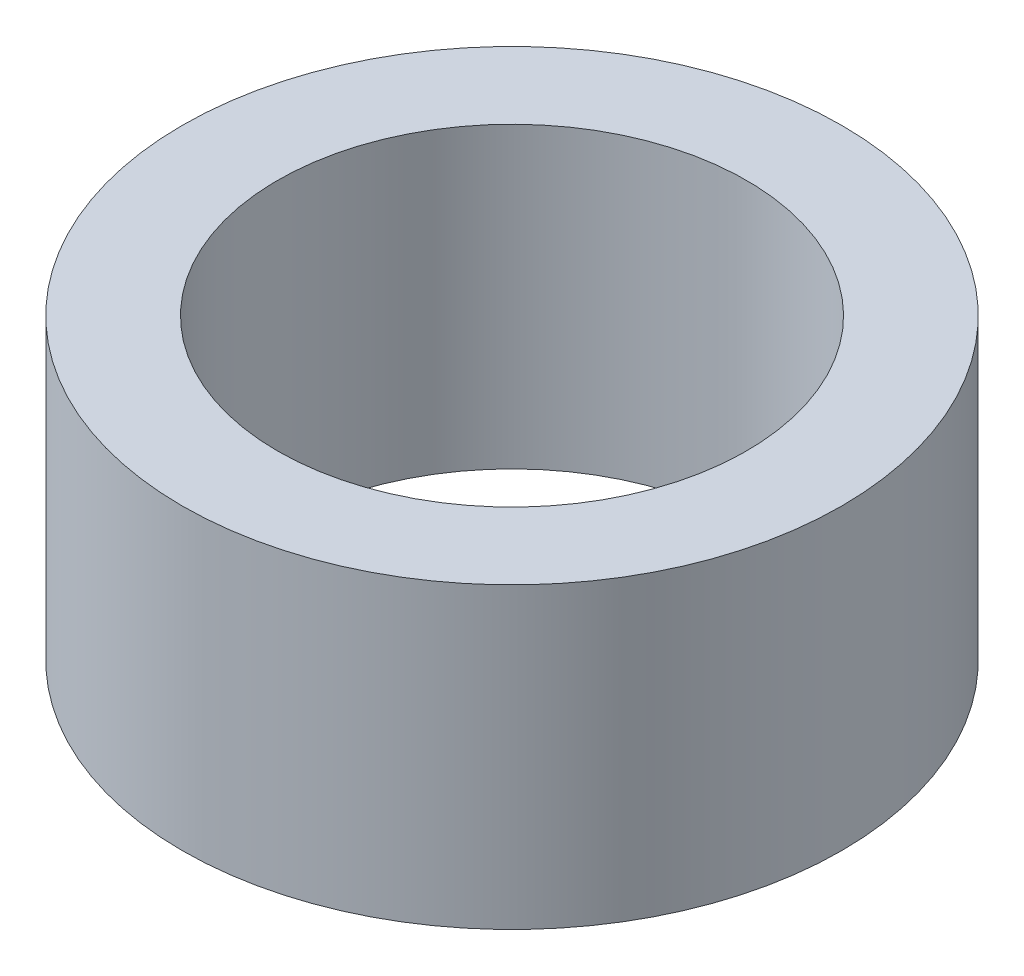
ISO-10303-21;
HEADER;
FILE_DESCRIPTION(('STEP AP214'),'2;1');
FILE_NAME('part.step','',(''),(''),'','','');
FILE_SCHEMA(('AUTOMOTIVE_DESIGN { 1 0 10303 214 1 1 1 1 }'));
ENDSEC;
DATA;
#1=APPLICATION_CONTEXT('core data for automotive mechanical design processes');
#2=APPLICATION_PROTOCOL_DEFINITION('international standard','automotive_design',2000,#1);
#3=PRODUCT_CONTEXT('',#1,'mechanical');
#4=PRODUCT('Part','Part','',(#3));
#5=PRODUCT_RELATED_PRODUCT_CATEGORY('part','',(#4));
#6=PRODUCT_DEFINITION_FORMATION('','',#4);
#7=PRODUCT_DEFINITION_CONTEXT('part definition',#1,'design');
#8=PRODUCT_DEFINITION('design','',#6,#7);
#9=PRODUCT_DEFINITION_SHAPE('','',#8);
#10=(LENGTH_UNIT() NAMED_UNIT(*) SI_UNIT(.MILLI.,.METRE.));
#11=(NAMED_UNIT(*) PLANE_ANGLE_UNIT() SI_UNIT($,.RADIAN.));
#12=(NAMED_UNIT(*) SI_UNIT($,.STERADIAN.) SOLID_ANGLE_UNIT());
#13=UNCERTAINTY_MEASURE_WITH_UNIT(LENGTH_MEASURE(1.E-05),#10,'distance_accuracy_value','');
#14=(GEOMETRIC_REPRESENTATION_CONTEXT(3) GLOBAL_UNCERTAINTY_ASSIGNED_CONTEXT((#13)) GLOBAL_UNIT_ASSIGNED_CONTEXT((#10,
#11,#12)) REPRESENTATION_CONTEXT('',''));
#15=CARTESIAN_POINT('',(0.,0.,0.));
#16=DIRECTION('',(0.,0.,1.));
#17=DIRECTION('',(1.,0.,0.));
#18=AXIS2_PLACEMENT_3D('',#15,#16,#17);
#19=CARTESIAN_POINT('',(0.,2.037,0.));
#20=DIRECTION('',(0.,1.,0.));
#21=DIRECTION('',(0.,0.,1.));
#22=AXIS2_PLACEMENT_3D('',#19,#20,#21);
#23=PLANE('',#22);
#24=CARTESIAN_POINT('',(0.,2.037,0.));
#25=DIRECTION('',(0.,1.,0.));
#26=DIRECTION('',(0.,0.,1.));
#27=AXIS2_PLACEMENT_3D('',#24,#25,#26);
#28=CIRCLE('',#27,2.25);
#29=CARTESIAN_POINT('',(0.,2.037,2.25));
#30=VERTEX_POINT('',#29);
#31=EDGE_CURVE('E10',#30,#30,#28,.T.);
#32=ORIENTED_EDGE('',*,*,#31,.T.);
#33=EDGE_LOOP('',(#32));
#34=FACE_BOUND('',#33,.T.);
#35=CARTESIAN_POINT('',(0.,2.037,0.));
#36=DIRECTION('',(0.,1.,0.));
#37=DIRECTION('',(0.,0.,1.));
#38=AXIS2_PLACEMENT_3D('',#35,#36,#37);
#39=CIRCLE('',#38,1.6);
#40=CARTESIAN_POINT('',(0.,2.037,1.6));
#41=VERTEX_POINT('',#40);
#42=EDGE_CURVE('E42',#41,#41,#39,.T.);
#43=ORIENTED_EDGE('',*,*,#42,.F.);
#44=EDGE_LOOP('',(#43));
#45=FACE_BOUND('',#44,.T.);
#46=ADVANCED_FACE('F31',(#34,#45),#23,.T.);
#47=CARTESIAN_POINT('',(0.,0.,0.));
#48=DIRECTION('',(0.,1.,0.));
#49=DIRECTION('',(0.,0.,1.));
#50=AXIS2_PLACEMENT_3D('',#47,#48,#49);
#51=PLANE('',#50);
#52=CARTESIAN_POINT('',(0.,0.,0.));
#53=DIRECTION('',(0.,1.,0.));
#54=DIRECTION('',(0.,0.,1.));
#55=AXIS2_PLACEMENT_3D('',#52,#53,#54);
#56=CIRCLE('',#55,2.25);
#57=CARTESIAN_POINT('',(0.,0.,2.25));
#58=VERTEX_POINT('',#57);
#59=EDGE_CURVE('E35',#58,#58,#56,.T.);
#60=ORIENTED_EDGE('',*,*,#59,.F.);
#61=EDGE_LOOP('',(#60));
#62=FACE_BOUND('',#61,.T.);
#63=CARTESIAN_POINT('',(0.,0.,0.));
#64=DIRECTION('',(0.,1.,0.));
#65=DIRECTION('',(0.,0.,1.));
#66=AXIS2_PLACEMENT_3D('',#63,#64,#65);
#67=CIRCLE('',#66,1.6);
#68=CARTESIAN_POINT('',(0.,0.,1.6));
#69=VERTEX_POINT('',#68);
#70=EDGE_CURVE('E44',#69,#69,#67,.T.);
#71=ORIENTED_EDGE('',*,*,#70,.T.);
#72=EDGE_LOOP('',(#71));
#73=FACE_BOUND('',#72,.T.);
#74=ADVANCED_FACE('F54',(#62,#73),#51,.F.);
#75=CARTESIAN_POINT('',(0.,2.037,0.));
#76=DIRECTION('',(0.,-1.,0.));
#77=DIRECTION('',(0.,0.,-1.));
#78=AXIS2_PLACEMENT_3D('',#75,#76,#77);
#79=CYLINDRICAL_SURFACE('',#78,2.25);
#80=ORIENTED_EDGE('',*,*,#31,.F.);
#81=EDGE_LOOP('',(#80));
#82=FACE_BOUND('',#81,.T.);
#83=ORIENTED_EDGE('',*,*,#59,.T.);
#84=EDGE_LOOP('',(#83));
#85=FACE_BOUND('',#84,.T.);
#86=ADVANCED_FACE('F33',(#82,#85),#79,.T.);
#87=CARTESIAN_POINT('',(0.,2.037,0.));
#88=DIRECTION('',(0.,-1.,0.));
#89=DIRECTION('',(0.,0.,-1.));
#90=AXIS2_PLACEMENT_3D('',#87,#88,#89);
#91=CYLINDRICAL_SURFACE('',#90,1.6);
#92=ORIENTED_EDGE('',*,*,#42,.T.);
#93=EDGE_LOOP('',(#92));
#94=FACE_BOUND('',#93,.T.);
#95=ORIENTED_EDGE('',*,*,#70,.F.);
#96=EDGE_LOOP('',(#95));
#97=FACE_BOUND('',#96,.T.);
#98=ADVANCED_FACE('F50',(#94,#97),#91,.F.);
#99=CLOSED_SHELL('',(#46,#74,#86,#98));
#100=MANIFOLD_SOLID_BREP('B2',#99);
#101=ADVANCED_BREP_SHAPE_REPRESENTATION('',(#18,#100),#14);
#102=SHAPE_DEFINITION_REPRESENTATION(#9,#101);
ENDSEC;
END-ISO-10303-21;
